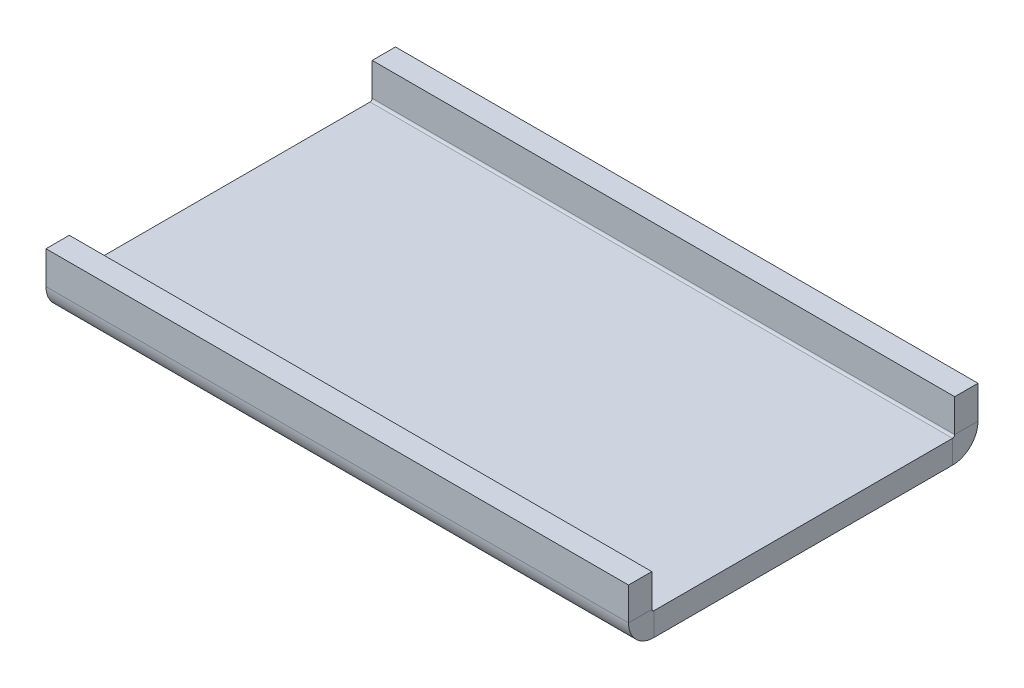
ISO-10303-21;
HEADER;
FILE_DESCRIPTION(('STEP AP214'),'2;1');
FILE_NAME('part.step','',(''),(''),'','','');
FILE_SCHEMA(('AUTOMOTIVE_DESIGN { 1 0 10303 214 1 1 1 1 }'));
ENDSEC;
DATA;
#1=APPLICATION_CONTEXT('core data for automotive mechanical design processes');
#2=APPLICATION_PROTOCOL_DEFINITION('international standard','automotive_design',2000,#1);
#3=PRODUCT_CONTEXT('',#1,'mechanical');
#4=PRODUCT('Part','Part','',(#3));
#5=PRODUCT_RELATED_PRODUCT_CATEGORY('part','',(#4));
#6=PRODUCT_DEFINITION_FORMATION('','',#4);
#7=PRODUCT_DEFINITION_CONTEXT('part definition',#1,'design');
#8=PRODUCT_DEFINITION('design','',#6,#7);
#9=PRODUCT_DEFINITION_SHAPE('','',#8);
#10=(LENGTH_UNIT() NAMED_UNIT(*) SI_UNIT(.MILLI.,.METRE.));
#11=(NAMED_UNIT(*) PLANE_ANGLE_UNIT() SI_UNIT($,.RADIAN.));
#12=(NAMED_UNIT(*) SI_UNIT($,.STERADIAN.) SOLID_ANGLE_UNIT());
#13=UNCERTAINTY_MEASURE_WITH_UNIT(LENGTH_MEASURE(1.E-05),#10,'distance_accuracy_value','');
#14=(GEOMETRIC_REPRESENTATION_CONTEXT(3) GLOBAL_UNCERTAINTY_ASSIGNED_CONTEXT((#13)) GLOBAL_UNIT_ASSIGNED_CONTEXT((#10,
#11,#12)) REPRESENTATION_CONTEXT('',''));
#15=CARTESIAN_POINT('',(0.,0.,0.));
#16=DIRECTION('',(0.,0.,1.));
#17=DIRECTION('',(1.,0.,0.));
#18=AXIS2_PLACEMENT_3D('',#15,#16,#17);
#19=CARTESIAN_POINT('',(0.,-4.,0.));
#20=DIRECTION('',(0.,1.,0.));
#21=DIRECTION('',(0.,0.,1.));
#22=AXIS2_PLACEMENT_3D('',#19,#20,#21);
#23=PLANE('',#22);
#24=DIRECTION('',(-1.,0.,0.));
#25=VECTOR('',#24,1.);
#26=CARTESIAN_POINT('',(-100.,-4.,-111.2634));
#27=LINE('',#26,#25);
#28=CARTESIAN_POINT('',(-100.,-4.,-111.2634));
#29=VERTEX_POINT('',#28);
#30=CARTESIAN_POINT('',(100.,-4.,-111.2634));
#31=VERTEX_POINT('',#30);
#32=EDGE_CURVE('E182',#29,#31,#27,.F.);
#33=ORIENTED_EDGE('',*,*,#32,.T.);
#34=DIRECTION('',(0.,0.,-1.));
#35=VECTOR('',#34,1.);
#36=CARTESIAN_POINT('',(100.,-4.,0.));
#37=LINE('',#36,#35);
#38=CARTESIAN_POINT('',(100.,-4.,-8.7366));
#39=VERTEX_POINT('',#38);
#40=EDGE_CURVE('E93',#39,#31,#37,.T.);
#41=ORIENTED_EDGE('',*,*,#40,.F.);
#42=DIRECTION('',(1.,0.,0.));
#43=VECTOR('',#42,1.);
#44=CARTESIAN_POINT('',(100.,-4.,-8.7366));
#45=LINE('',#44,#43);
#46=CARTESIAN_POINT('',(-100.,-4.,-8.7366));
#47=VERTEX_POINT('',#46);
#48=EDGE_CURVE('E277',#39,#47,#45,.F.);
#49=ORIENTED_EDGE('',*,*,#48,.T.);
#50=DIRECTION('',(0.,0.,1.));
#51=VECTOR('',#50,1.);
#52=CARTESIAN_POINT('',(-100.,-4.,-120.));
#53=LINE('',#52,#51);
#54=EDGE_CURVE('E13',#29,#47,#53,.T.);
#55=ORIENTED_EDGE('',*,*,#54,.F.);
#56=EDGE_LOOP('',(#33,#41,#49,#55));
#57=FACE_BOUND('',#56,.T.);
#58=ADVANCED_FACE('F84',(#57),#23,.F.);
#59=CARTESIAN_POINT('',(0.,4.,0.));
#60=DIRECTION('',(0.,1.,0.));
#61=DIRECTION('',(0.,0.,1.));
#62=AXIS2_PLACEMENT_3D('',#59,#60,#61);
#63=PLANE('',#62);
#64=DIRECTION('',(0.,0.,-1.));
#65=VECTOR('',#64,1.);
#66=CARTESIAN_POINT('',(100.,4.,0.));
#67=LINE('',#66,#65);
#68=CARTESIAN_POINT('',(100.,4.,-8.7366));
#69=VERTEX_POINT('',#68);
#70=CARTESIAN_POINT('',(100.,4.,-111.2634));
#71=VERTEX_POINT('',#70);
#72=EDGE_CURVE('E295',#69,#71,#67,.T.);
#73=ORIENTED_EDGE('',*,*,#72,.T.);
#74=DIRECTION('',(-1.,0.,0.));
#75=VECTOR('',#74,1.);
#76=CARTESIAN_POINT('',(-100.,4.,-111.2634));
#77=LINE('',#76,#75);
#78=CARTESIAN_POINT('',(-100.,4.,-111.2634));
#79=VERTEX_POINT('',#78);
#80=EDGE_CURVE('E236',#79,#71,#77,.F.);
#81=ORIENTED_EDGE('',*,*,#80,.F.);
#82=DIRECTION('',(0.,0.,1.));
#83=VECTOR('',#82,1.);
#84=CARTESIAN_POINT('',(-100.,4.,-120.));
#85=LINE('',#84,#83);
#86=CARTESIAN_POINT('',(-100.,4.,-8.7366));
#87=VERTEX_POINT('',#86);
#88=EDGE_CURVE('E88',#79,#87,#85,.T.);
#89=ORIENTED_EDGE('',*,*,#88,.T.);
#90=DIRECTION('',(1.,0.,0.));
#91=VECTOR('',#90,1.);
#92=CARTESIAN_POINT('',(100.,4.,-8.7366));
#93=LINE('',#92,#91);
#94=EDGE_CURVE('E101',#69,#87,#93,.F.);
#95=ORIENTED_EDGE('',*,*,#94,.F.);
#96=EDGE_LOOP('',(#73,#81,#89,#95));
#97=FACE_BOUND('',#96,.T.);
#98=ADVANCED_FACE('F300',(#97),#63,.T.);
#99=CARTESIAN_POINT('',(-100.,-4.,-120.));
#100=DIRECTION('',(-1.,0.,0.));
#101=DIRECTION('',(0.,0.,1.));
#102=AXIS2_PLACEMENT_3D('',#99,#100,#101);
#103=PLANE('',#102);
#104=ORIENTED_EDGE('',*,*,#88,.F.);
#105=DIRECTION('',(0.,-1.,0.));
#106=VECTOR('',#105,1.);
#107=CARTESIAN_POINT('',(-100.,4.,-111.2634));
#108=LINE('',#107,#106);
#109=EDGE_CURVE('E232',#79,#29,#108,.T.);
#110=ORIENTED_EDGE('',*,*,#109,.T.);
#111=ORIENTED_EDGE('',*,*,#54,.T.);
#112=DIRECTION('',(0.,-1.,0.));
#113=VECTOR('',#112,1.);
#114=CARTESIAN_POINT('',(-100.,4.,-8.7366));
#115=LINE('',#114,#113);
#116=EDGE_CURVE('E292',#87,#47,#115,.T.);
#117=ORIENTED_EDGE('',*,*,#116,.F.);
#118=EDGE_LOOP('',(#104,#110,#111,#117));
#119=FACE_BOUND('',#118,.T.);
#120=ADVANCED_FACE('F301',(#119),#103,.T.);
#121=CARTESIAN_POINT('',(100.,-4.,0.));
#122=DIRECTION('',(1.,0.,0.));
#123=DIRECTION('',(0.,0.,-1.));
#124=AXIS2_PLACEMENT_3D('',#121,#122,#123);
#125=PLANE('',#124);
#126=DIRECTION('',(0.,-1.,0.));
#127=VECTOR('',#126,1.);
#128=CARTESIAN_POINT('',(100.,4.,-111.2634));
#129=LINE('',#128,#127);
#130=EDGE_CURVE('E240',#71,#31,#129,.T.);
#131=ORIENTED_EDGE('',*,*,#130,.F.);
#132=ORIENTED_EDGE('',*,*,#72,.F.);
#133=DIRECTION('',(0.,-1.,0.));
#134=VECTOR('',#133,1.);
#135=CARTESIAN_POINT('',(100.,4.,-8.7366));
#136=LINE('',#135,#134);
#137=EDGE_CURVE('E283',#69,#39,#136,.T.);
#138=ORIENTED_EDGE('',*,*,#137,.T.);
#139=ORIENTED_EDGE('',*,*,#40,.T.);
#140=EDGE_LOOP('',(#131,#132,#138,#139));
#141=FACE_BOUND('',#140,.T.);
#142=ADVANCED_FACE('F86',(#141),#125,.T.);
#143=CARTESIAN_POINT('',(-100.,4.7366,-8.7366));
#144=DIRECTION('',(-1.,0.,0.));
#145=DIRECTION('',(0.,0.,1.));
#146=AXIS2_PLACEMENT_3D('',#143,#144,#145);
#147=PLANE('',#146);
#148=DIRECTION('',(0.,0.,1.));
#149=VECTOR('',#148,1.);
#150=CARTESIAN_POINT('',(-100.,4.7366,0.));
#151=LINE('',#150,#149);
#152=CARTESIAN_POINT('',(-100.,4.73659999999999,-8.));
#153=VERTEX_POINT('',#152);
#154=CARTESIAN_POINT('',(-100.,4.73659999999997,0.));
#155=VERTEX_POINT('',#154);
#156=EDGE_CURVE('E243',#153,#155,#151,.T.);
#157=ORIENTED_EDGE('',*,*,#156,.F.);
#158=CARTESIAN_POINT('',(-100.,4.7366,-8.7366));
#159=DIRECTION('',(1.,0.,0.));
#160=DIRECTION('',(0.,0.,-1.));
#161=AXIS2_PLACEMENT_3D('',#158,#159,#160);
#162=CIRCLE('',#161,0.7366);
#163=EDGE_CURVE('E286',#87,#153,#162,.F.);
#164=ORIENTED_EDGE('',*,*,#163,.F.);
#165=ORIENTED_EDGE('',*,*,#116,.T.);
#166=CARTESIAN_POINT('',(-100.,4.7366,-8.7366));
#167=DIRECTION('',(1.,0.,0.));
#168=DIRECTION('',(0.,0.,-1.));
#169=AXIS2_PLACEMENT_3D('',#166,#167,#168);
#170=CIRCLE('',#169,8.7366);
#171=EDGE_CURVE('E279',#47,#155,#170,.F.);
#172=ORIENTED_EDGE('',*,*,#171,.T.);
#173=EDGE_LOOP('',(#157,#164,#165,#172));
#174=FACE_BOUND('',#173,.T.);
#175=ADVANCED_FACE('F309',(#174),#147,.T.);
#176=CARTESIAN_POINT('',(100.,4.7366,-8.7366));
#177=DIRECTION('',(-1.,0.,0.));
#178=DIRECTION('',(0.,0.,1.));
#179=AXIS2_PLACEMENT_3D('',#176,#177,#178);
#180=PLANE('',#179);
#181=CARTESIAN_POINT('',(100.,4.7366,-8.7366));
#182=DIRECTION('',(1.,0.,0.));
#183=DIRECTION('',(0.,0.,-1.));
#184=AXIS2_PLACEMENT_3D('',#181,#182,#183);
#185=CIRCLE('',#184,0.7366);
#186=CARTESIAN_POINT('',(100.,4.73659999999999,-8.));
#187=VERTEX_POINT('',#186);
#188=EDGE_CURVE('E247',#187,#69,#185,.T.);
#189=ORIENTED_EDGE('',*,*,#188,.F.);
#190=DIRECTION('',(0.,0.,1.));
#191=VECTOR('',#190,1.);
#192=CARTESIAN_POINT('',(100.,4.7366,-8.));
#193=LINE('',#192,#191);
#194=CARTESIAN_POINT('',(100.,4.7366,0.));
#195=VERTEX_POINT('',#194);
#196=EDGE_CURVE('E270',#187,#195,#193,.T.);
#197=ORIENTED_EDGE('',*,*,#196,.T.);
#198=CARTESIAN_POINT('',(100.,4.7366,-8.7366));
#199=DIRECTION('',(1.,0.,0.));
#200=DIRECTION('',(0.,0.,-1.));
#201=AXIS2_PLACEMENT_3D('',#198,#199,#200);
#202=CIRCLE('',#201,8.7366);
#203=EDGE_CURVE('E280',#195,#39,#202,.T.);
#204=ORIENTED_EDGE('',*,*,#203,.T.);
#205=ORIENTED_EDGE('',*,*,#137,.F.);
#206=EDGE_LOOP('',(#189,#197,#204,#205));
#207=FACE_BOUND('',#206,.T.);
#208=ADVANCED_FACE('F329',(#207),#180,.F.);
#209=CARTESIAN_POINT('',(100.,4.7366,-8.7366));
#210=DIRECTION('',(1.,0.,0.));
#211=DIRECTION('',(0.,0.,1.));
#212=AXIS2_PLACEMENT_3D('',#209,#210,#211);
#213=CYLINDRICAL_SURFACE('',#212,8.7366);
#214=ORIENTED_EDGE('',*,*,#48,.F.);
#215=ORIENTED_EDGE('',*,*,#203,.F.);
#216=DIRECTION('',(1.,0.,0.));
#217=VECTOR('',#216,1.);
#218=CARTESIAN_POINT('',(0.,4.7366,0.));
#219=LINE('',#218,#217);
#220=EDGE_CURVE('E267',#155,#195,#219,.T.);
#221=ORIENTED_EDGE('',*,*,#220,.F.);
#222=ORIENTED_EDGE('',*,*,#171,.F.);
#223=EDGE_LOOP('',(#214,#215,#221,#222));
#224=FACE_BOUND('',#223,.T.);
#225=ADVANCED_FACE('F334',(#224),#213,.T.);
#226=CARTESIAN_POINT('',(100.,4.7366,-8.7366));
#227=DIRECTION('',(1.,0.,0.));
#228=DIRECTION('',(0.,0.,1.));
#229=AXIS2_PLACEMENT_3D('',#226,#227,#228);
#230=CYLINDRICAL_SURFACE('',#229,0.7366);
#231=ORIENTED_EDGE('',*,*,#94,.T.);
#232=ORIENTED_EDGE('',*,*,#163,.T.);
#233=DIRECTION('',(-1.,0.,0.));
#234=VECTOR('',#233,1.);
#235=CARTESIAN_POINT('',(-100.,4.7366,-8.));
#236=LINE('',#235,#234);
#237=EDGE_CURVE('E273',#153,#187,#236,.F.);
#238=ORIENTED_EDGE('',*,*,#237,.T.);
#239=ORIENTED_EDGE('',*,*,#188,.T.);
#240=EDGE_LOOP('',(#231,#232,#238,#239));
#241=FACE_BOUND('',#240,.T.);
#242=ADVANCED_FACE('F306',(#241),#230,.F.);
#243=CARTESIAN_POINT('',(100.,3.99999999999997,0.));
#244=DIRECTION('',(1.,0.,0.));
#245=DIRECTION('',(0.,0.,-1.));
#246=AXIS2_PLACEMENT_3D('',#243,#244,#245);
#247=PLANE('',#246);
#248=DIRECTION('',(0.,-1.,0.));
#249=VECTOR('',#248,1.);
#250=CARTESIAN_POINT('',(100.,3.99999999999997,0.));
#251=LINE('',#250,#249);
#252=CARTESIAN_POINT('',(100.,16.,0.));
#253=VERTEX_POINT('',#252);
#254=EDGE_CURVE('E251',#253,#195,#251,.T.);
#255=ORIENTED_EDGE('',*,*,#254,.T.);
#256=ORIENTED_EDGE('',*,*,#196,.F.);
#257=DIRECTION('',(0.,1.,0.));
#258=VECTOR('',#257,1.);
#259=CARTESIAN_POINT('',(100.,0.,-8.00000000000001));
#260=LINE('',#259,#258);
#261=CARTESIAN_POINT('',(100.,16.,-7.99999999999996));
#262=VERTEX_POINT('',#261);
#263=EDGE_CURVE('E259',#262,#187,#260,.F.);
#264=ORIENTED_EDGE('',*,*,#263,.F.);
#265=DIRECTION('',(0.,0.,-1.));
#266=VECTOR('',#265,1.);
#267=CARTESIAN_POINT('',(100.,16.,0.));
#268=LINE('',#267,#266);
#269=EDGE_CURVE('E245',#253,#262,#268,.T.);
#270=ORIENTED_EDGE('',*,*,#269,.F.);
#271=EDGE_LOOP('',(#255,#256,#264,#270));
#272=FACE_BOUND('',#271,.T.);
#273=ADVANCED_FACE('F327',(#272),#247,.T.);
#274=CARTESIAN_POINT('',(-100.,16.,0.));
#275=DIRECTION('',(-1.,0.,0.));
#276=DIRECTION('',(0.,-1.,0.));
#277=AXIS2_PLACEMENT_3D('',#274,#275,#276);
#278=PLANE('',#277);
#279=DIRECTION('',(0.,-1.,0.));
#280=VECTOR('',#279,1.);
#281=CARTESIAN_POINT('',(-100.,-2.31296463463574E-13,-8.00000000000001));
#282=LINE('',#281,#280);
#283=CARTESIAN_POINT('',(-100.,16.,-7.99999999999996));
#284=VERTEX_POINT('',#283);
#285=EDGE_CURVE('E265',#153,#284,#282,.F.);
#286=ORIENTED_EDGE('',*,*,#285,.F.);
#287=ORIENTED_EDGE('',*,*,#156,.T.);
#288=DIRECTION('',(0.,1.,0.));
#289=VECTOR('',#288,1.);
#290=CARTESIAN_POINT('',(-100.,16.,0.));
#291=LINE('',#290,#289);
#292=CARTESIAN_POINT('',(-100.,16.,0.));
#293=VERTEX_POINT('',#292);
#294=EDGE_CURVE('E257',#155,#293,#291,.T.);
#295=ORIENTED_EDGE('',*,*,#294,.T.);
#296=DIRECTION('',(0.,0.,-1.));
#297=VECTOR('',#296,1.);
#298=CARTESIAN_POINT('',(-100.,16.,0.));
#299=LINE('',#298,#297);
#300=EDGE_CURVE('E248',#293,#284,#299,.T.);
#301=ORIENTED_EDGE('',*,*,#300,.T.);
#302=EDGE_LOOP('',(#286,#287,#295,#301));
#303=FACE_BOUND('',#302,.T.);
#304=ADVANCED_FACE('F313',(#303),#278,.T.);
#305=CARTESIAN_POINT('',(0.,0.,0.));
#306=DIRECTION('',(0.,0.,1.));
#307=DIRECTION('',(0.,-1.,0.));
#308=AXIS2_PLACEMENT_3D('',#305,#306,#307);
#309=PLANE('',#308);
#310=ORIENTED_EDGE('',*,*,#294,.F.);
#311=ORIENTED_EDGE('',*,*,#220,.T.);
#312=ORIENTED_EDGE('',*,*,#254,.F.);
#313=DIRECTION('',(1.,0.,0.));
#314=VECTOR('',#313,1.);
#315=CARTESIAN_POINT('',(100.,16.,0.));
#316=LINE('',#315,#314);
#317=EDGE_CURVE('E254',#293,#253,#316,.T.);
#318=ORIENTED_EDGE('',*,*,#317,.F.);
#319=EDGE_LOOP('',(#310,#311,#312,#318));
#320=FACE_BOUND('',#319,.T.);
#321=ADVANCED_FACE('F317',(#320),#309,.T.);
#322=CARTESIAN_POINT('',(0.,0.,-8.00000000000001));
#323=DIRECTION('',(0.,0.,1.));
#324=DIRECTION('',(0.,-1.,0.));
#325=AXIS2_PLACEMENT_3D('',#322,#323,#324);
#326=PLANE('',#325);
#327=ORIENTED_EDGE('',*,*,#237,.F.);
#328=ORIENTED_EDGE('',*,*,#285,.T.);
#329=DIRECTION('',(-1.,0.,0.));
#330=VECTOR('',#329,1.);
#331=CARTESIAN_POINT('',(0.,16.,-7.99999999999996));
#332=LINE('',#331,#330);
#333=EDGE_CURVE('E262',#284,#262,#332,.F.);
#334=ORIENTED_EDGE('',*,*,#333,.T.);
#335=ORIENTED_EDGE('',*,*,#263,.T.);
#336=EDGE_LOOP('',(#327,#328,#334,#335));
#337=FACE_BOUND('',#336,.T.);
#338=ADVANCED_FACE('F324',(#337),#326,.F.);
#339=CARTESIAN_POINT('',(100.,16.,0.));
#340=DIRECTION('',(0.,1.,0.));
#341=DIRECTION('',(0.,0.,1.));
#342=AXIS2_PLACEMENT_3D('',#339,#340,#341);
#343=PLANE('',#342);
#344=ORIENTED_EDGE('',*,*,#333,.F.);
#345=ORIENTED_EDGE('',*,*,#300,.F.);
#346=ORIENTED_EDGE('',*,*,#317,.T.);
#347=ORIENTED_EDGE('',*,*,#269,.T.);
#348=EDGE_LOOP('',(#344,#345,#346,#347));
#349=FACE_BOUND('',#348,.T.);
#350=ADVANCED_FACE('F321',(#349),#343,.T.);
#351=CARTESIAN_POINT('',(100.,4.7366,-111.2634));
#352=DIRECTION('',(1.,0.,0.));
#353=DIRECTION('',(0.,0.,-1.));
#354=AXIS2_PLACEMENT_3D('',#351,#352,#353);
#355=PLANE('',#354);
#356=DIRECTION('',(0.,0.,-1.));
#357=VECTOR('',#356,1.);
#358=CARTESIAN_POINT('',(100.,4.73660000000006,-120.));
#359=LINE('',#358,#357);
#360=CARTESIAN_POINT('',(100.,4.7366,-112.));
#361=VERTEX_POINT('',#360);
#362=CARTESIAN_POINT('',(100.,4.7366,-120.));
#363=VERTEX_POINT('',#362);
#364=EDGE_CURVE('E227',#361,#363,#359,.T.);
#365=ORIENTED_EDGE('',*,*,#364,.F.);
#366=CARTESIAN_POINT('',(100.,4.7366,-111.2634));
#367=DIRECTION('',(-1.,0.,0.));
#368=DIRECTION('',(0.,0.,1.));
#369=AXIS2_PLACEMENT_3D('',#366,#367,#368);
#370=CIRCLE('',#369,0.736600000000004);
#371=EDGE_CURVE('E185',#71,#361,#370,.F.);
#372=ORIENTED_EDGE('',*,*,#371,.F.);
#373=ORIENTED_EDGE('',*,*,#130,.T.);
#374=CARTESIAN_POINT('',(100.,4.7366,-111.2634));
#375=DIRECTION('',(-1.,0.,0.));
#376=DIRECTION('',(0.,0.,1.));
#377=AXIS2_PLACEMENT_3D('',#374,#375,#376);
#378=CIRCLE('',#377,8.7366);
#379=EDGE_CURVE('E231',#31,#363,#378,.F.);
#380=ORIENTED_EDGE('',*,*,#379,.T.);
#381=EDGE_LOOP('',(#365,#372,#373,#380));
#382=FACE_BOUND('',#381,.T.);
#383=ADVANCED_FACE('F385',(#382),#355,.T.);
#384=CARTESIAN_POINT('',(-100.,4.7366,-111.2634));
#385=DIRECTION('',(1.,0.,0.));
#386=DIRECTION('',(0.,0.,-1.));
#387=AXIS2_PLACEMENT_3D('',#384,#385,#386);
#388=PLANE('',#387);
#389=CARTESIAN_POINT('',(-100.,4.7366,-111.2634));
#390=DIRECTION('',(-1.,0.,0.));
#391=DIRECTION('',(0.,0.,1.));
#392=AXIS2_PLACEMENT_3D('',#389,#390,#391);
#393=CIRCLE('',#392,0.736600000000004);
#394=CARTESIAN_POINT('',(-100.,4.7366,-112.));
#395=VERTEX_POINT('',#394);
#396=EDGE_CURVE('E192',#395,#79,#393,.T.);
#397=ORIENTED_EDGE('',*,*,#396,.F.);
#398=DIRECTION('',(0.,0.,-1.));
#399=VECTOR('',#398,1.);
#400=CARTESIAN_POINT('',(-100.,4.73660000000001,-112.));
#401=LINE('',#400,#399);
#402=CARTESIAN_POINT('',(-100.,4.73660000000006,-120.));
#403=VERTEX_POINT('',#402);
#404=EDGE_CURVE('E189',#395,#403,#401,.T.);
#405=ORIENTED_EDGE('',*,*,#404,.T.);
#406=CARTESIAN_POINT('',(-100.,4.7366,-111.2634));
#407=DIRECTION('',(-1.,0.,0.));
#408=DIRECTION('',(0.,0.,1.));
#409=AXIS2_PLACEMENT_3D('',#406,#407,#408);
#410=CIRCLE('',#409,8.7366);
#411=EDGE_CURVE('E175',#403,#29,#410,.T.);
#412=ORIENTED_EDGE('',*,*,#411,.T.);
#413=ORIENTED_EDGE('',*,*,#109,.F.);
#414=EDGE_LOOP('',(#397,#405,#412,#413));
#415=FACE_BOUND('',#414,.T.);
#416=ADVANCED_FACE('F190',(#415),#388,.F.);
#417=CARTESIAN_POINT('',(-100.,4.7366,-111.2634));
#418=DIRECTION('',(-1.,0.,0.));
#419=DIRECTION('',(0.,0.,-1.));
#420=AXIS2_PLACEMENT_3D('',#417,#418,#419);
#421=CYLINDRICAL_SURFACE('',#420,8.7366);
#422=ORIENTED_EDGE('',*,*,#32,.F.);
#423=ORIENTED_EDGE('',*,*,#411,.F.);
#424=DIRECTION('',(-1.,0.,0.));
#425=VECTOR('',#424,1.);
#426=CARTESIAN_POINT('',(0.,4.73660000000006,-120.));
#427=LINE('',#426,#425);
#428=EDGE_CURVE('E180',#363,#403,#427,.T.);
#429=ORIENTED_EDGE('',*,*,#428,.F.);
#430=ORIENTED_EDGE('',*,*,#379,.F.);
#431=EDGE_LOOP('',(#422,#423,#429,#430));
#432=FACE_BOUND('',#431,.T.);
#433=ADVANCED_FACE('F177',(#432),#421,.T.);
#434=CARTESIAN_POINT('',(-100.,4.7366,-111.2634));
#435=DIRECTION('',(-1.,0.,0.));
#436=DIRECTION('',(0.,0.,-1.));
#437=AXIS2_PLACEMENT_3D('',#434,#435,#436);
#438=CYLINDRICAL_SURFACE('',#437,0.736600000000004);
#439=ORIENTED_EDGE('',*,*,#80,.T.);
#440=ORIENTED_EDGE('',*,*,#371,.T.);
#441=DIRECTION('',(1.,0.,0.));
#442=VECTOR('',#441,1.);
#443=CARTESIAN_POINT('',(100.,4.73660000000001,-112.));
#444=LINE('',#443,#442);
#445=EDGE_CURVE('E197',#361,#395,#444,.F.);
#446=ORIENTED_EDGE('',*,*,#445,.T.);
#447=ORIENTED_EDGE('',*,*,#396,.T.);
#448=EDGE_LOOP('',(#439,#440,#446,#447));
#449=FACE_BOUND('',#448,.T.);
#450=ADVANCED_FACE('F337',(#449),#438,.F.);
#451=CARTESIAN_POINT('',(-100.,4.,-120.));
#452=DIRECTION('',(-1.,0.,0.));
#453=DIRECTION('',(0.,-1.,0.));
#454=AXIS2_PLACEMENT_3D('',#451,#452,#453);
#455=PLANE('',#454);
#456=DIRECTION('',(0.,-1.,0.));
#457=VECTOR('',#456,1.);
#458=CARTESIAN_POINT('',(-100.,4.,-120.));
#459=LINE('',#458,#457);
#460=CARTESIAN_POINT('',(-100.,16.,-120.));
#461=VERTEX_POINT('',#460);
#462=EDGE_CURVE('E204',#461,#403,#459,.T.);
#463=ORIENTED_EDGE('',*,*,#462,.T.);
#464=ORIENTED_EDGE('',*,*,#404,.F.);
#465=DIRECTION('',(0.,1.,0.));
#466=VECTOR('',#465,1.);
#467=CARTESIAN_POINT('',(-100.,-1.15648231731787E-13,-112.));
#468=LINE('',#467,#466);
#469=CARTESIAN_POINT('',(-100.,16.,-112.));
#470=VERTEX_POINT('',#469);
#471=EDGE_CURVE('E220',#470,#395,#468,.F.);
#472=ORIENTED_EDGE('',*,*,#471,.F.);
#473=DIRECTION('',(0.,0.,1.));
#474=VECTOR('',#473,1.);
#475=CARTESIAN_POINT('',(-100.,16.,-120.));
#476=LINE('',#475,#474);
#477=EDGE_CURVE('E209',#461,#470,#476,.T.);
#478=ORIENTED_EDGE('',*,*,#477,.F.);
#479=EDGE_LOOP('',(#463,#464,#472,#478));
#480=FACE_BOUND('',#479,.T.);
#481=ADVANCED_FACE('F208',(#480),#455,.T.);
#482=CARTESIAN_POINT('',(100.,16.,-120.));
#483=DIRECTION('',(1.,0.,0.));
#484=DIRECTION('',(0.,1.,0.));
#485=AXIS2_PLACEMENT_3D('',#482,#483,#484);
#486=PLANE('',#485);
#487=DIRECTION('',(0.,-1.,0.));
#488=VECTOR('',#487,1.);
#489=CARTESIAN_POINT('',(100.,-1.15648231731787E-13,-112.));
#490=LINE('',#489,#488);
#491=CARTESIAN_POINT('',(100.,16.,-112.));
#492=VERTEX_POINT('',#491);
#493=EDGE_CURVE('E206',#361,#492,#490,.F.);
#494=ORIENTED_EDGE('',*,*,#493,.F.);
#495=ORIENTED_EDGE('',*,*,#364,.T.);
#496=DIRECTION('',(0.,1.,0.));
#497=VECTOR('',#496,1.);
#498=CARTESIAN_POINT('',(100.,16.,-120.));
#499=LINE('',#498,#497);
#500=CARTESIAN_POINT('',(100.,16.,-120.));
#501=VERTEX_POINT('',#500);
#502=EDGE_CURVE('E205',#363,#501,#499,.T.);
#503=ORIENTED_EDGE('',*,*,#502,.T.);
#504=DIRECTION('',(0.,0.,1.));
#505=VECTOR('',#504,1.);
#506=CARTESIAN_POINT('',(100.,16.,-120.));
#507=LINE('',#506,#505);
#508=EDGE_CURVE('E211',#501,#492,#507,.T.);
#509=ORIENTED_EDGE('',*,*,#508,.T.);
#510=EDGE_LOOP('',(#494,#495,#503,#509));
#511=FACE_BOUND('',#510,.T.);
#512=ADVANCED_FACE('F344',(#511),#486,.T.);
#513=CARTESIAN_POINT('',(0.,0.,-120.));
#514=DIRECTION('',(0.,0.,-1.));
#515=DIRECTION('',(-1.,0.,0.));
#516=AXIS2_PLACEMENT_3D('',#513,#514,#515);
#517=PLANE('',#516);
#518=ORIENTED_EDGE('',*,*,#502,.F.);
#519=ORIENTED_EDGE('',*,*,#428,.T.);
#520=ORIENTED_EDGE('',*,*,#462,.F.);
#521=DIRECTION('',(-1.,0.,0.));
#522=VECTOR('',#521,1.);
#523=CARTESIAN_POINT('',(-100.,16.,-120.));
#524=LINE('',#523,#522);
#525=EDGE_CURVE('E212',#501,#461,#524,.T.);
#526=ORIENTED_EDGE('',*,*,#525,.F.);
#527=EDGE_LOOP('',(#518,#519,#520,#526));
#528=FACE_BOUND('',#527,.T.);
#529=ADVANCED_FACE('F202',(#528),#517,.T.);
#530=CARTESIAN_POINT('',(0.,0.,-112.));
#531=DIRECTION('',(0.,0.,-1.));
#532=DIRECTION('',(-1.,0.,0.));
#533=AXIS2_PLACEMENT_3D('',#530,#531,#532);
#534=PLANE('',#533);
#535=ORIENTED_EDGE('',*,*,#445,.F.);
#536=ORIENTED_EDGE('',*,*,#493,.T.);
#537=DIRECTION('',(1.,0.,0.));
#538=VECTOR('',#537,1.);
#539=CARTESIAN_POINT('',(0.,16.,-112.));
#540=LINE('',#539,#538);
#541=EDGE_CURVE('E222',#492,#470,#540,.F.);
#542=ORIENTED_EDGE('',*,*,#541,.T.);
#543=ORIENTED_EDGE('',*,*,#471,.T.);
#544=EDGE_LOOP('',(#535,#536,#542,#543));
#545=FACE_BOUND('',#544,.T.);
#546=ADVANCED_FACE('F342',(#545),#534,.F.);
#547=CARTESIAN_POINT('',(-100.,16.,-120.));
#548=DIRECTION('',(0.,1.,0.));
#549=DIRECTION('',(0.,0.,1.));
#550=AXIS2_PLACEMENT_3D('',#547,#548,#549);
#551=PLANE('',#550);
#552=ORIENTED_EDGE('',*,*,#541,.F.);
#553=ORIENTED_EDGE('',*,*,#508,.F.);
#554=ORIENTED_EDGE('',*,*,#525,.T.);
#555=ORIENTED_EDGE('',*,*,#477,.T.);
#556=EDGE_LOOP('',(#552,#553,#554,#555));
#557=FACE_BOUND('',#556,.T.);
#558=ADVANCED_FACE('F348',(#557),#551,.T.);
#559=CLOSED_SHELL('',(#58,#98,#120,#142,#175,#208,#225,#242,#273,#304,#321,#338,#350,#383,#416,
#433,#450,#481,#512,#529,#546,#558));
#560=MANIFOLD_SOLID_BREP('B2',#559);
#561=ADVANCED_BREP_SHAPE_REPRESENTATION('',(#18,#560),#14);
#562=SHAPE_DEFINITION_REPRESENTATION(#9,#561);
ENDSEC;
END-ISO-10303-21;
